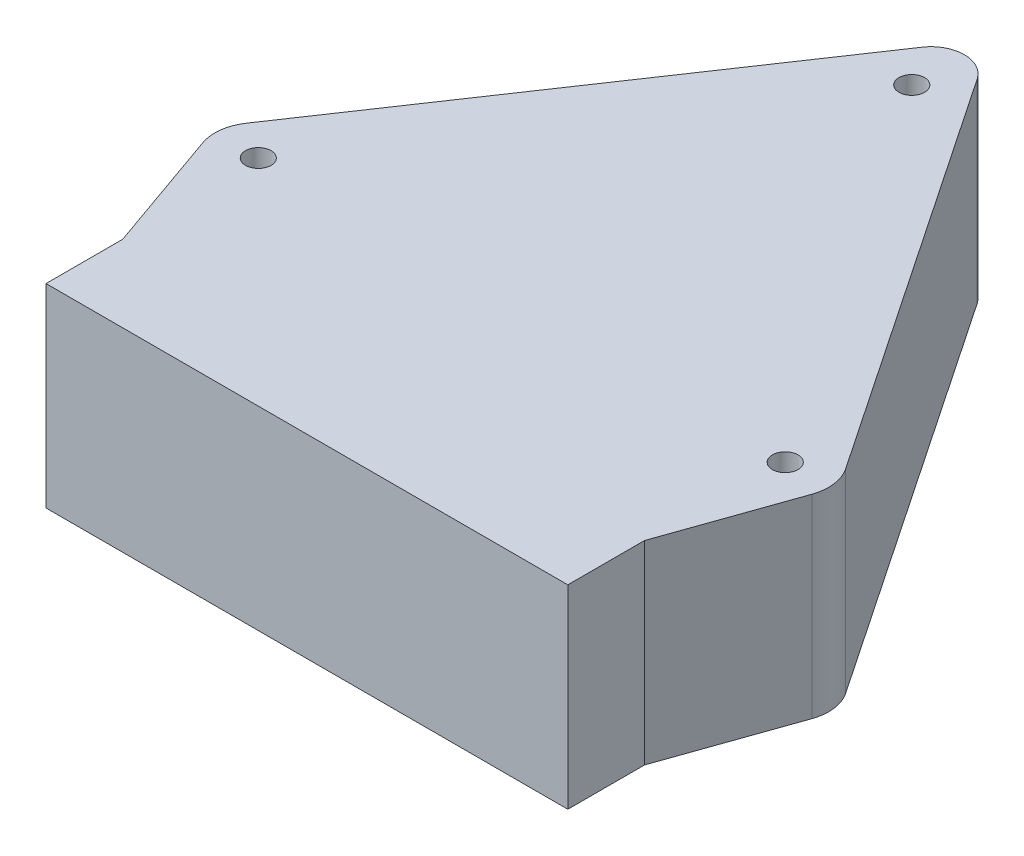
ISO-10303-21;
HEADER;
FILE_DESCRIPTION(('STEP AP214'),'2;1');
FILE_NAME('part.step','',(''),(''),'','','');
FILE_SCHEMA(('AUTOMOTIVE_DESIGN { 1 0 10303 214 1 1 1 1 }'));
ENDSEC;
DATA;
#1=APPLICATION_CONTEXT('core data for automotive mechanical design processes');
#2=APPLICATION_PROTOCOL_DEFINITION('international standard','automotive_design',2000,#1);
#3=PRODUCT_CONTEXT('',#1,'mechanical');
#4=PRODUCT('Part','Part','',(#3));
#5=PRODUCT_RELATED_PRODUCT_CATEGORY('part','',(#4));
#6=PRODUCT_DEFINITION_FORMATION('','',#4);
#7=PRODUCT_DEFINITION_CONTEXT('part definition',#1,'design');
#8=PRODUCT_DEFINITION('design','',#6,#7);
#9=PRODUCT_DEFINITION_SHAPE('','',#8);
#10=(LENGTH_UNIT() NAMED_UNIT(*) SI_UNIT(.MILLI.,.METRE.));
#11=(NAMED_UNIT(*) PLANE_ANGLE_UNIT() SI_UNIT($,.RADIAN.));
#12=(NAMED_UNIT(*) SI_UNIT($,.STERADIAN.) SOLID_ANGLE_UNIT());
#13=UNCERTAINTY_MEASURE_WITH_UNIT(LENGTH_MEASURE(1.E-05),#10,'distance_accuracy_value','');
#14=(GEOMETRIC_REPRESENTATION_CONTEXT(3) GLOBAL_UNCERTAINTY_ASSIGNED_CONTEXT((#13)) GLOBAL_UNIT_ASSIGNED_CONTEXT((#10,
#11,#12)) REPRESENTATION_CONTEXT('',''));
#15=CARTESIAN_POINT('',(0.,0.,0.));
#16=DIRECTION('',(0.,0.,1.));
#17=DIRECTION('',(1.,0.,0.));
#18=AXIS2_PLACEMENT_3D('',#15,#16,#17);
#19=CARTESIAN_POINT('',(-5.39027210363095,19.,-50.397653109274));
#20=DIRECTION('',(0.82927263132784,0.,0.558844256417297));
#21=DIRECTION('',(0.558844256417297,0.,-0.82927263132784));
#22=AXIS2_PLACEMENT_3D('',#19,#20,#21);
#23=PLANE('',#22);
#24=DIRECTION('',(-0.558844256417297,0.,0.829272631327839));
#25=VECTOR('',#24,1.);
#26=CARTESIAN_POINT('',(-5.39027210363095,-19.,-50.397653109274));
#27=LINE('',#26,#25);
#28=CARTESIAN_POINT('',(-5.39027210363095,-19.,-50.397653109274));
#29=VERTEX_POINT('',#28);
#30=CARTESIAN_POINT('',(-58.5488173662866,-19.,28.4846583778913));
#31=VERTEX_POINT('',#30);
#32=EDGE_CURVE('E146',#29,#31,#27,.T.);
#33=ORIENTED_EDGE('',*,*,#32,.T.);
#34=DIRECTION('',(0.,-1.,0.));
#35=VECTOR('',#34,1.);
#36=CARTESIAN_POINT('',(-58.5488173662866,19.,28.4846583778913));
#37=LINE('',#36,#35);
#38=CARTESIAN_POINT('',(-58.5488173662866,19.,28.4846583778913));
#39=VERTEX_POINT('',#38);
#40=EDGE_CURVE('E42',#39,#31,#37,.T.);
#41=ORIENTED_EDGE('',*,*,#40,.F.);
#42=DIRECTION('',(-0.558844256417297,0.,0.829272631327839));
#43=VECTOR('',#42,1.);
#44=CARTESIAN_POINT('',(-5.39027210363095,19.,-50.397653109274));
#45=LINE('',#44,#43);
#46=CARTESIAN_POINT('',(-5.39027210363095,19.,-50.397653109274));
#47=VERTEX_POINT('',#46);
#48=EDGE_CURVE('E100',#47,#39,#45,.T.);
#49=ORIENTED_EDGE('',*,*,#48,.F.);
#50=DIRECTION('',(0.,-1.,0.));
#51=VECTOR('',#50,1.);
#52=CARTESIAN_POINT('',(-5.39027210363095,19.,-50.397653109274));
#53=LINE('',#52,#51);
#54=EDGE_CURVE('E11',#47,#29,#53,.T.);
#55=ORIENTED_EDGE('',*,*,#54,.T.);
#56=EDGE_LOOP('',(#33,#41,#49,#55));
#57=FACE_BOUND('',#56,.T.);
#58=ADVANCED_FACE('F34',(#57),#23,.F.);
#59=CARTESIAN_POINT('',(-51.5,19.,33.2348345574384));
#60=DIRECTION('',(0.,-1.,0.));
#61=DIRECTION('',(0.,0.,-1.));
#62=AXIS2_PLACEMENT_3D('',#59,#60,#61);
#63=CYLINDRICAL_SURFACE('',#62,8.49999999999999);
#64=CARTESIAN_POINT('',(-51.5,-19.,33.2348345574384));
#65=DIRECTION('',(0.,1.,0.));
#66=DIRECTION('',(0.,0.,1.));
#67=AXIS2_PLACEMENT_3D('',#64,#65,#66);
#68=CIRCLE('',#67,8.49999999999999);
#69=CARTESIAN_POINT('',(-59.5170333611945,-19.,36.0592240641272));
#70=VERTEX_POINT('',#69);
#71=EDGE_CURVE('E148',#31,#70,#68,.T.);
#72=ORIENTED_EDGE('',*,*,#71,.T.);
#73=DIRECTION('',(0.,-1.,0.));
#74=VECTOR('',#73,1.);
#75=CARTESIAN_POINT('',(-59.5170333611945,19.,36.0592240641272));
#76=LINE('',#75,#74);
#77=CARTESIAN_POINT('',(-59.5170333611945,19.,36.0592240641272));
#78=VERTEX_POINT('',#77);
#79=EDGE_CURVE('E176',#78,#70,#76,.T.);
#80=ORIENTED_EDGE('',*,*,#79,.F.);
#81=CARTESIAN_POINT('',(-51.5,19.,33.2348345574384));
#82=DIRECTION('',(0.,1.,0.));
#83=DIRECTION('',(0.,0.,1.));
#84=AXIS2_PLACEMENT_3D('',#81,#82,#83);
#85=CIRCLE('',#84,8.49999999999999);
#86=EDGE_CURVE('E184',#39,#78,#85,.T.);
#87=ORIENTED_EDGE('',*,*,#86,.F.);
#88=ORIENTED_EDGE('',*,*,#40,.T.);
#89=EDGE_LOOP('',(#72,#80,#87,#88));
#90=FACE_BOUND('',#89,.T.);
#91=ADVANCED_FACE('F182',(#90),#63,.T.);
#92=CARTESIAN_POINT('',(-59.5170333611945,19.,36.0592240641272));
#93=DIRECTION('',(0.943180395434652,0.,-0.332281118433975));
#94=DIRECTION('',(-0.332281118433975,0.,-0.943180395434652));
#95=AXIS2_PLACEMENT_3D('',#92,#93,#94);
#96=PLANE('',#95);
#97=DIRECTION('',(0.332281118433975,0.,0.943180395434652));
#98=VECTOR('',#97,1.);
#99=CARTESIAN_POINT('',(-59.5170333611945,-19.,36.0592240641272));
#100=LINE('',#99,#98);
#101=CARTESIAN_POINT('',(-51.,-19.,60.2348345574384));
#102=VERTEX_POINT('',#101);
#103=EDGE_CURVE('E151',#70,#102,#100,.T.);
#104=ORIENTED_EDGE('',*,*,#103,.T.);
#105=DIRECTION('',(0.,-1.,0.));
#106=VECTOR('',#105,1.);
#107=CARTESIAN_POINT('',(-51.,19.,60.2348345574384));
#108=LINE('',#107,#106);
#109=CARTESIAN_POINT('',(-51.,19.,60.2348345574384));
#110=VERTEX_POINT('',#109);
#111=EDGE_CURVE('E173',#110,#102,#108,.T.);
#112=ORIENTED_EDGE('',*,*,#111,.F.);
#113=DIRECTION('',(0.332281118433975,0.,0.943180395434652));
#114=VECTOR('',#113,1.);
#115=CARTESIAN_POINT('',(-59.5170333611945,19.,36.0592240641272));
#116=LINE('',#115,#114);
#117=EDGE_CURVE('E203',#78,#110,#116,.T.);
#118=ORIENTED_EDGE('',*,*,#117,.F.);
#119=ORIENTED_EDGE('',*,*,#79,.T.);
#120=EDGE_LOOP('',(#104,#112,#118,#119));
#121=FACE_BOUND('',#120,.T.);
#122=ADVANCED_FACE('F194',(#121),#96,.F.);
#123=CARTESIAN_POINT('',(-51.,19.,60.2348345574384));
#124=DIRECTION('',(1.,0.,0.));
#125=DIRECTION('',(0.,0.,-1.));
#126=AXIS2_PLACEMENT_3D('',#123,#124,#125);
#127=PLANE('',#126);
#128=DIRECTION('',(0.,0.,1.));
#129=VECTOR('',#128,1.);
#130=CARTESIAN_POINT('',(-51.,-19.,60.2348345574384));
#131=LINE('',#130,#129);
#132=CARTESIAN_POINT('',(-51.,-19.,75.2348345574384));
#133=VERTEX_POINT('',#132);
#134=EDGE_CURVE('E153',#102,#133,#131,.T.);
#135=ORIENTED_EDGE('',*,*,#134,.T.);
#136=DIRECTION('',(0.,-1.,0.));
#137=VECTOR('',#136,1.);
#138=CARTESIAN_POINT('',(-51.,19.,75.2348345574384));
#139=LINE('',#138,#137);
#140=CARTESIAN_POINT('',(-51.,19.,75.2348345574384));
#141=VERTEX_POINT('',#140);
#142=EDGE_CURVE('E170',#141,#133,#139,.T.);
#143=ORIENTED_EDGE('',*,*,#142,.F.);
#144=DIRECTION('',(0.,0.,1.));
#145=VECTOR('',#144,1.);
#146=CARTESIAN_POINT('',(-51.,19.,60.2348345574384));
#147=LINE('',#146,#145);
#148=EDGE_CURVE('E200',#110,#141,#147,.T.);
#149=ORIENTED_EDGE('',*,*,#148,.F.);
#150=ORIENTED_EDGE('',*,*,#111,.T.);
#151=EDGE_LOOP('',(#135,#143,#149,#150));
#152=FACE_BOUND('',#151,.T.);
#153=ADVANCED_FACE('F198',(#152),#127,.F.);
#154=CARTESIAN_POINT('',(-51.,19.,75.2348345574384));
#155=DIRECTION('',(0.,0.,-1.));
#156=DIRECTION('',(-1.,0.,0.));
#157=AXIS2_PLACEMENT_3D('',#154,#155,#156);
#158=PLANE('',#157);
#159=DIRECTION('',(1.,0.,0.));
#160=VECTOR('',#159,1.);
#161=CARTESIAN_POINT('',(-51.,-19.,75.2348345574384));
#162=LINE('',#161,#160);
#163=CARTESIAN_POINT('',(51.,-19.,75.2348345574384));
#164=VERTEX_POINT('',#163);
#165=EDGE_CURVE('E155',#133,#164,#162,.T.);
#166=ORIENTED_EDGE('',*,*,#165,.T.);
#167=DIRECTION('',(0.,-1.,0.));
#168=VECTOR('',#167,1.);
#169=CARTESIAN_POINT('',(51.,19.,75.2348345574384));
#170=LINE('',#169,#168);
#171=CARTESIAN_POINT('',(51.,19.,75.2348345574384));
#172=VERTEX_POINT('',#171);
#173=EDGE_CURVE('E167',#172,#164,#170,.T.);
#174=ORIENTED_EDGE('',*,*,#173,.F.);
#175=DIRECTION('',(1.,0.,0.));
#176=VECTOR('',#175,1.);
#177=CARTESIAN_POINT('',(-51.,19.,75.2348345574384));
#178=LINE('',#177,#176);
#179=EDGE_CURVE('E202',#141,#172,#178,.T.);
#180=ORIENTED_EDGE('',*,*,#179,.F.);
#181=ORIENTED_EDGE('',*,*,#142,.T.);
#182=EDGE_LOOP('',(#166,#174,#180,#181));
#183=FACE_BOUND('',#182,.T.);
#184=ADVANCED_FACE('F262',(#183),#158,.F.);
#185=CARTESIAN_POINT('',(51.,19.,60.2348345574384));
#186=DIRECTION('',(-1.,0.,0.));
#187=DIRECTION('',(0.,0.,1.));
#188=AXIS2_PLACEMENT_3D('',#185,#186,#187);
#189=PLANE('',#188);
#190=DIRECTION('',(0.,0.,-1.));
#191=VECTOR('',#190,1.);
#192=CARTESIAN_POINT('',(51.,-19.,60.2348345574384));
#193=LINE('',#192,#191);
#194=CARTESIAN_POINT('',(51.,-19.,60.2348345574384));
#195=VERTEX_POINT('',#194);
#196=EDGE_CURVE('E157',#164,#195,#193,.T.);
#197=ORIENTED_EDGE('',*,*,#196,.T.);
#198=DIRECTION('',(0.,-1.,0.));
#199=VECTOR('',#198,1.);
#200=CARTESIAN_POINT('',(51.,19.,60.2348345574384));
#201=LINE('',#200,#199);
#202=CARTESIAN_POINT('',(51.,19.,60.2348345574384));
#203=VERTEX_POINT('',#202);
#204=EDGE_CURVE('E135',#203,#195,#201,.T.);
#205=ORIENTED_EDGE('',*,*,#204,.F.);
#206=DIRECTION('',(0.,0.,-1.));
#207=VECTOR('',#206,1.);
#208=CARTESIAN_POINT('',(51.,19.,60.2348345574384));
#209=LINE('',#208,#207);
#210=EDGE_CURVE('E126',#172,#203,#209,.T.);
#211=ORIENTED_EDGE('',*,*,#210,.F.);
#212=ORIENTED_EDGE('',*,*,#173,.T.);
#213=EDGE_LOOP('',(#197,#205,#211,#212));
#214=FACE_BOUND('',#213,.T.);
#215=ADVANCED_FACE('F259',(#214),#189,.F.);
#216=CARTESIAN_POINT('',(59.5170333611945,19.,36.0592240641272));
#217=DIRECTION('',(-0.943180395434652,0.,-0.332281118433975));
#218=DIRECTION('',(-0.332281118433975,0.,0.943180395434652));
#219=AXIS2_PLACEMENT_3D('',#216,#217,#218);
#220=PLANE('',#219);
#221=DIRECTION('',(0.332281118433975,0.,-0.943180395434652));
#222=VECTOR('',#221,1.);
#223=CARTESIAN_POINT('',(59.5170333611945,-19.,36.0592240641272));
#224=LINE('',#223,#222);
#225=CARTESIAN_POINT('',(59.5170333611945,-19.,36.0592240641272));
#226=VERTEX_POINT('',#225);
#227=EDGE_CURVE('E134',#195,#226,#224,.T.);
#228=ORIENTED_EDGE('',*,*,#227,.T.);
#229=DIRECTION('',(0.,-1.,0.));
#230=VECTOR('',#229,1.);
#231=CARTESIAN_POINT('',(59.5170333611945,19.,36.0592240641272));
#232=LINE('',#231,#230);
#233=CARTESIAN_POINT('',(59.5170333611945,19.,36.0592240641272));
#234=VERTEX_POINT('',#233);
#235=EDGE_CURVE('E131',#234,#226,#232,.T.);
#236=ORIENTED_EDGE('',*,*,#235,.F.);
#237=DIRECTION('',(0.332281118433975,0.,-0.943180395434652));
#238=VECTOR('',#237,1.);
#239=CARTESIAN_POINT('',(59.5170333611945,19.,36.0592240641272));
#240=LINE('',#239,#238);
#241=EDGE_CURVE('E120',#203,#234,#240,.T.);
#242=ORIENTED_EDGE('',*,*,#241,.F.);
#243=ORIENTED_EDGE('',*,*,#204,.T.);
#244=EDGE_LOOP('',(#228,#236,#242,#243));
#245=FACE_BOUND('',#244,.T.);
#246=ADVANCED_FACE('F132',(#245),#220,.F.);
#247=CARTESIAN_POINT('',(51.5,19.,33.2348345574384));
#248=DIRECTION('',(0.,-1.,0.));
#249=DIRECTION('',(0.,0.,-1.));
#250=AXIS2_PLACEMENT_3D('',#247,#248,#249);
#251=CYLINDRICAL_SURFACE('',#250,8.49999999999999);
#252=CARTESIAN_POINT('',(51.5,-19.,33.2348345574384));
#253=DIRECTION('',(0.,1.,0.));
#254=DIRECTION('',(0.,0.,-1.));
#255=AXIS2_PLACEMENT_3D('',#252,#253,#254);
#256=CIRCLE('',#255,8.49999999999999);
#257=CARTESIAN_POINT('',(58.5488173662866,-19.,28.4846583778914));
#258=VERTEX_POINT('',#257);
#259=EDGE_CURVE('E86',#226,#258,#256,.T.);
#260=ORIENTED_EDGE('',*,*,#259,.T.);
#261=DIRECTION('',(0.,-1.,0.));
#262=VECTOR('',#261,1.);
#263=CARTESIAN_POINT('',(58.5488173662866,19.,28.4846583778914));
#264=LINE('',#263,#262);
#265=CARTESIAN_POINT('',(58.5488173662866,19.,28.4846583778914));
#266=VERTEX_POINT('',#265);
#267=EDGE_CURVE('E136',#266,#258,#264,.T.);
#268=ORIENTED_EDGE('',*,*,#267,.F.);
#269=CARTESIAN_POINT('',(51.5,19.,33.2348345574384));
#270=DIRECTION('',(0.,1.,0.));
#271=DIRECTION('',(0.,0.,-1.));
#272=AXIS2_PLACEMENT_3D('',#269,#270,#271);
#273=CIRCLE('',#272,8.49999999999999);
#274=EDGE_CURVE('E124',#234,#266,#273,.T.);
#275=ORIENTED_EDGE('',*,*,#274,.F.);
#276=ORIENTED_EDGE('',*,*,#235,.T.);
#277=EDGE_LOOP('',(#260,#268,#275,#276));
#278=FACE_BOUND('',#277,.T.);
#279=ADVANCED_FACE('F138',(#278),#251,.T.);
#280=CARTESIAN_POINT('',(5.39027210363095,19.,-50.397653109274));
#281=DIRECTION('',(-0.82927263132784,0.,0.558844256417297));
#282=DIRECTION('',(0.558844256417297,0.,0.82927263132784));
#283=AXIS2_PLACEMENT_3D('',#280,#281,#282);
#284=PLANE('',#283);
#285=DIRECTION('',(-0.558844256417297,0.,-0.829272631327839));
#286=VECTOR('',#285,1.);
#287=CARTESIAN_POINT('',(5.39027210363095,-19.,-50.397653109274));
#288=LINE('',#287,#286);
#289=CARTESIAN_POINT('',(5.39027210363095,-19.,-50.397653109274));
#290=VERTEX_POINT('',#289);
#291=EDGE_CURVE('E93',#258,#290,#288,.T.);
#292=ORIENTED_EDGE('',*,*,#291,.T.);
#293=DIRECTION('',(0.,-1.,0.));
#294=VECTOR('',#293,1.);
#295=CARTESIAN_POINT('',(5.39027210363095,19.,-50.397653109274));
#296=LINE('',#295,#294);
#297=CARTESIAN_POINT('',(5.39027210363095,19.,-50.397653109274));
#298=VERTEX_POINT('',#297);
#299=EDGE_CURVE('E142',#298,#290,#296,.T.);
#300=ORIENTED_EDGE('',*,*,#299,.F.);
#301=DIRECTION('',(-0.558844256417297,0.,-0.829272631327839));
#302=VECTOR('',#301,1.);
#303=CARTESIAN_POINT('',(5.39027210363095,19.,-50.397653109274));
#304=LINE('',#303,#302);
#305=EDGE_CURVE('E140',#266,#298,#304,.T.);
#306=ORIENTED_EDGE('',*,*,#305,.F.);
#307=ORIENTED_EDGE('',*,*,#267,.T.);
#308=EDGE_LOOP('',(#292,#300,#306,#307));
#309=FACE_BOUND('',#308,.T.);
#310=ADVANCED_FACE('F308',(#309),#284,.F.);
#311=CARTESIAN_POINT('',(0.,19.,-46.7651654425616));
#312=DIRECTION('',(0.,-1.,0.));
#313=DIRECTION('',(0.,0.,-1.));
#314=AXIS2_PLACEMENT_3D('',#311,#312,#313);
#315=CYLINDRICAL_SURFACE('',#314,6.49999999999999);
#316=CARTESIAN_POINT('',(0.,-19.,-46.7651654425616));
#317=DIRECTION('',(0.,1.,0.));
#318=DIRECTION('',(0.,0.,1.));
#319=AXIS2_PLACEMENT_3D('',#316,#317,#318);
#320=CIRCLE('',#319,6.49999999999999);
#321=EDGE_CURVE('E162',#290,#29,#320,.T.);
#322=ORIENTED_EDGE('',*,*,#321,.T.);
#323=ORIENTED_EDGE('',*,*,#54,.F.);
#324=CARTESIAN_POINT('',(0.,19.,-46.7651654425616));
#325=DIRECTION('',(0.,1.,0.));
#326=DIRECTION('',(0.,0.,-1.));
#327=AXIS2_PLACEMENT_3D('',#324,#325,#326);
#328=CIRCLE('',#327,6.49999999999999);
#329=EDGE_CURVE('E50',#298,#47,#328,.T.);
#330=ORIENTED_EDGE('',*,*,#329,.F.);
#331=ORIENTED_EDGE('',*,*,#299,.T.);
#332=EDGE_LOOP('',(#322,#323,#330,#331));
#333=FACE_BOUND('',#332,.T.);
#334=ADVANCED_FACE('F233',(#333),#315,.T.);
#335=CARTESIAN_POINT('',(0.,19.,-46.7651654425616));
#336=DIRECTION('',(0.,-1.,0.));
#337=DIRECTION('',(0.,0.,-1.));
#338=AXIS2_PLACEMENT_3D('',#335,#336,#337);
#339=PLANE('',#338);
#340=CARTESIAN_POINT('',(-51.5,19.,33.2348345574384));
#341=DIRECTION('',(0.,1.,0.));
#342=DIRECTION('',(0.,0.,1.));
#343=AXIS2_PLACEMENT_3D('',#340,#341,#342);
#344=CIRCLE('',#343,2.5);
#345=CARTESIAN_POINT('',(-51.5,19.,35.7348345574384));
#346=VERTEX_POINT('',#345);
#347=EDGE_CURVE('E225',#346,#346,#344,.T.);
#348=ORIENTED_EDGE('',*,*,#347,.F.);
#349=EDGE_LOOP('',(#348));
#350=FACE_BOUND('',#349,.T.);
#351=CARTESIAN_POINT('',(0.,19.,-43.));
#352=DIRECTION('',(0.,1.,0.));
#353=DIRECTION('',(0.,0.,1.));
#354=AXIS2_PLACEMENT_3D('',#351,#352,#353);
#355=CIRCLE('',#354,2.5);
#356=CARTESIAN_POINT('',(0.,19.,-40.5));
#357=VERTEX_POINT('',#356);
#358=EDGE_CURVE('E219',#357,#357,#355,.T.);
#359=ORIENTED_EDGE('',*,*,#358,.F.);
#360=EDGE_LOOP('',(#359));
#361=FACE_BOUND('',#360,.T.);
#362=CARTESIAN_POINT('',(51.5,19.,33.2348345574384));
#363=DIRECTION('',(0.,1.,0.));
#364=DIRECTION('',(0.,0.,1.));
#365=AXIS2_PLACEMENT_3D('',#362,#363,#364);
#366=CIRCLE('',#365,2.5);
#367=CARTESIAN_POINT('',(51.5,19.,35.7348345574384));
#368=VERTEX_POINT('',#367);
#369=EDGE_CURVE('E213',#368,#368,#366,.T.);
#370=ORIENTED_EDGE('',*,*,#369,.F.);
#371=EDGE_LOOP('',(#370));
#372=FACE_BOUND('',#371,.T.);
#373=ORIENTED_EDGE('',*,*,#329,.T.);
#374=ORIENTED_EDGE('',*,*,#48,.T.);
#375=ORIENTED_EDGE('',*,*,#86,.T.);
#376=ORIENTED_EDGE('',*,*,#117,.T.);
#377=ORIENTED_EDGE('',*,*,#148,.T.);
#378=ORIENTED_EDGE('',*,*,#179,.T.);
#379=ORIENTED_EDGE('',*,*,#210,.T.);
#380=ORIENTED_EDGE('',*,*,#241,.T.);
#381=ORIENTED_EDGE('',*,*,#274,.T.);
#382=ORIENTED_EDGE('',*,*,#305,.T.);
#383=EDGE_LOOP('',(#373,#374,#375,#376,#377,#378,#379,#380,#381,#382));
#384=FACE_BOUND('',#383,.T.);
#385=ADVANCED_FACE('F122',(#350,#361,#372,#384),#339,.F.);
#386=CARTESIAN_POINT('',(0.,-19.,-46.7651654425616));
#387=DIRECTION('',(0.,-1.,0.));
#388=DIRECTION('',(0.,0.,-1.));
#389=AXIS2_PLACEMENT_3D('',#386,#387,#388);
#390=PLANE('',#389);
#391=CARTESIAN_POINT('',(-51.5,-19.,33.2348345574384));
#392=DIRECTION('',(0.,1.,0.));
#393=DIRECTION('',(0.,0.,1.));
#394=AXIS2_PLACEMENT_3D('',#391,#392,#393);
#395=CIRCLE('',#394,2.5);
#396=CARTESIAN_POINT('',(-51.5,-19.,35.7348345574384));
#397=VERTEX_POINT('',#396);
#398=EDGE_CURVE('E222',#397,#397,#395,.T.);
#399=ORIENTED_EDGE('',*,*,#398,.T.);
#400=EDGE_LOOP('',(#399));
#401=FACE_BOUND('',#400,.T.);
#402=CARTESIAN_POINT('',(0.,-19.,-43.));
#403=DIRECTION('',(0.,1.,0.));
#404=DIRECTION('',(0.,0.,1.));
#405=AXIS2_PLACEMENT_3D('',#402,#403,#404);
#406=CIRCLE('',#405,2.5);
#407=CARTESIAN_POINT('',(0.,-19.,-40.5));
#408=VERTEX_POINT('',#407);
#409=EDGE_CURVE('E216',#408,#408,#406,.T.);
#410=ORIENTED_EDGE('',*,*,#409,.T.);
#411=EDGE_LOOP('',(#410));
#412=FACE_BOUND('',#411,.T.);
#413=CARTESIAN_POINT('',(51.5,-19.,33.2348345574384));
#414=DIRECTION('',(0.,1.,0.));
#415=DIRECTION('',(0.,0.,1.));
#416=AXIS2_PLACEMENT_3D('',#413,#414,#415);
#417=CIRCLE('',#416,2.5);
#418=CARTESIAN_POINT('',(51.5,-19.,35.7348345574384));
#419=VERTEX_POINT('',#418);
#420=EDGE_CURVE('E149',#419,#419,#417,.T.);
#421=ORIENTED_EDGE('',*,*,#420,.T.);
#422=EDGE_LOOP('',(#421));
#423=FACE_BOUND('',#422,.T.);
#424=ORIENTED_EDGE('',*,*,#32,.F.);
#425=ORIENTED_EDGE('',*,*,#321,.F.);
#426=ORIENTED_EDGE('',*,*,#291,.F.);
#427=ORIENTED_EDGE('',*,*,#259,.F.);
#428=ORIENTED_EDGE('',*,*,#227,.F.);
#429=ORIENTED_EDGE('',*,*,#196,.F.);
#430=ORIENTED_EDGE('',*,*,#165,.F.);
#431=ORIENTED_EDGE('',*,*,#134,.F.);
#432=ORIENTED_EDGE('',*,*,#103,.F.);
#433=ORIENTED_EDGE('',*,*,#71,.F.);
#434=EDGE_LOOP('',(#424,#425,#426,#427,#428,#429,#430,#431,#432,#433));
#435=FACE_BOUND('',#434,.T.);
#436=ADVANCED_FACE('F188',(#401,#412,#423,#435),#390,.T.);
#437=CARTESIAN_POINT('',(51.5,19.,33.2348345574384));
#438=DIRECTION('',(0.,1.,0.));
#439=DIRECTION('',(0.,0.,1.));
#440=AXIS2_PLACEMENT_3D('',#437,#438,#439);
#441=CYLINDRICAL_SURFACE('',#440,2.5);
#442=ORIENTED_EDGE('',*,*,#420,.F.);
#443=EDGE_LOOP('',(#442));
#444=FACE_BOUND('',#443,.T.);
#445=ORIENTED_EDGE('',*,*,#369,.T.);
#446=EDGE_LOOP('',(#445));
#447=FACE_BOUND('',#446,.T.);
#448=ADVANCED_FACE('F239',(#444,#447),#441,.F.);
#449=CARTESIAN_POINT('',(0.,19.,-43.));
#450=DIRECTION('',(0.,1.,0.));
#451=DIRECTION('',(0.,0.,1.));
#452=AXIS2_PLACEMENT_3D('',#449,#450,#451);
#453=CYLINDRICAL_SURFACE('',#452,2.5);
#454=ORIENTED_EDGE('',*,*,#409,.F.);
#455=EDGE_LOOP('',(#454));
#456=FACE_BOUND('',#455,.T.);
#457=ORIENTED_EDGE('',*,*,#358,.T.);
#458=EDGE_LOOP('',(#457));
#459=FACE_BOUND('',#458,.T.);
#460=ADVANCED_FACE('F241',(#456,#459),#453,.F.);
#461=CARTESIAN_POINT('',(-51.5,19.,33.2348345574384));
#462=DIRECTION('',(0.,1.,0.));
#463=DIRECTION('',(0.,0.,1.));
#464=AXIS2_PLACEMENT_3D('',#461,#462,#463);
#465=CYLINDRICAL_SURFACE('',#464,2.5);
#466=ORIENTED_EDGE('',*,*,#398,.F.);
#467=EDGE_LOOP('',(#466));
#468=FACE_BOUND('',#467,.T.);
#469=ORIENTED_EDGE('',*,*,#347,.T.);
#470=EDGE_LOOP('',(#469));
#471=FACE_BOUND('',#470,.T.);
#472=ADVANCED_FACE('F229',(#468,#471),#465,.F.);
#473=CLOSED_SHELL('',(#58,#91,#122,#153,#184,#215,#246,#279,#310,#334,#385,#436,#448,#460,#472));
#474=MANIFOLD_SOLID_BREP('B2',#473);
#475=ADVANCED_BREP_SHAPE_REPRESENTATION('',(#18,#474),#14);
#476=SHAPE_DEFINITION_REPRESENTATION(#9,#475);
ENDSEC;
END-ISO-10303-21;
